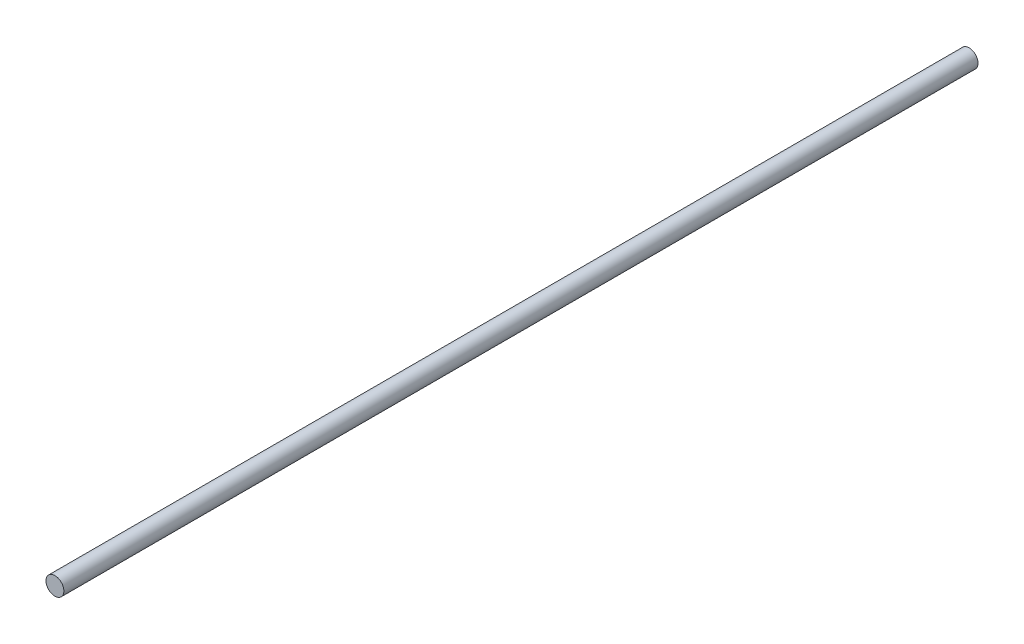
ISO-10303-21;
HEADER;
FILE_DESCRIPTION(('STEP AP214'),'2;1');
FILE_NAME('part.step','',(''),(''),'','','');
FILE_SCHEMA(('AUTOMOTIVE_DESIGN { 1 0 10303 214 1 1 1 1 }'));
ENDSEC;
DATA;
#1=APPLICATION_CONTEXT('core data for automotive mechanical design processes');
#2=APPLICATION_PROTOCOL_DEFINITION('international standard','automotive_design',2000,#1);
#3=PRODUCT_CONTEXT('',#1,'mechanical');
#4=PRODUCT('Part','Part','',(#3));
#5=PRODUCT_RELATED_PRODUCT_CATEGORY('part','',(#4));
#6=PRODUCT_DEFINITION_FORMATION('','',#4);
#7=PRODUCT_DEFINITION_CONTEXT('part definition',#1,'design');
#8=PRODUCT_DEFINITION('design','',#6,#7);
#9=PRODUCT_DEFINITION_SHAPE('','',#8);
#10=(LENGTH_UNIT() NAMED_UNIT(*) SI_UNIT(.MILLI.,.METRE.));
#11=(NAMED_UNIT(*) PLANE_ANGLE_UNIT() SI_UNIT($,.RADIAN.));
#12=(NAMED_UNIT(*) SI_UNIT($,.STERADIAN.) SOLID_ANGLE_UNIT());
#13=UNCERTAINTY_MEASURE_WITH_UNIT(LENGTH_MEASURE(1.E-05),#10,'distance_accuracy_value','');
#14=(GEOMETRIC_REPRESENTATION_CONTEXT(3) GLOBAL_UNCERTAINTY_ASSIGNED_CONTEXT((#13)) GLOBAL_UNIT_ASSIGNED_CONTEXT((#10,
#11,#12)) REPRESENTATION_CONTEXT('',''));
#15=CARTESIAN_POINT('',(0.,0.,0.));
#16=DIRECTION('',(0.,0.,1.));
#17=DIRECTION('',(1.,0.,0.));
#18=AXIS2_PLACEMENT_3D('',#15,#16,#17);
#19=CARTESIAN_POINT('',(0.,0.,307.));
#20=DIRECTION('',(0.,0.,-1.));
#21=DIRECTION('',(-1.,0.,0.));
#22=AXIS2_PLACEMENT_3D('',#19,#20,#21);
#23=CYLINDRICAL_SURFACE('',#22,3.);
#24=CARTESIAN_POINT('',(0.,0.,307.));
#25=DIRECTION('',(0.,0.,1.));
#26=DIRECTION('',(1.,0.,0.));
#27=AXIS2_PLACEMENT_3D('',#24,#25,#26);
#28=CIRCLE('',#27,3.);
#29=CARTESIAN_POINT('',(3.,0.,307.));
#30=VERTEX_POINT('',#29);
#31=EDGE_CURVE('E10',#30,#30,#28,.T.);
#32=ORIENTED_EDGE('',*,*,#31,.F.);
#33=EDGE_LOOP('',(#32));
#34=FACE_BOUND('',#33,.T.);
#35=CARTESIAN_POINT('',(0.,0.,0.));
#36=DIRECTION('',(0.,0.,1.));
#37=DIRECTION('',(1.,0.,0.));
#38=AXIS2_PLACEMENT_3D('',#35,#36,#37);
#39=CIRCLE('',#38,3.);
#40=CARTESIAN_POINT('',(3.,0.,0.));
#41=VERTEX_POINT('',#40);
#42=EDGE_CURVE('E42',#41,#41,#39,.T.);
#43=ORIENTED_EDGE('',*,*,#42,.T.);
#44=EDGE_LOOP('',(#43));
#45=FACE_BOUND('',#44,.T.);
#46=ADVANCED_FACE('F39',(#34,#45),#23,.T.);
#47=CARTESIAN_POINT('',(0.,0.,307.));
#48=DIRECTION('',(0.,0.,1.));
#49=DIRECTION('',(1.,0.,0.));
#50=AXIS2_PLACEMENT_3D('',#47,#48,#49);
#51=PLANE('',#50);
#52=ORIENTED_EDGE('',*,*,#31,.T.);
#53=EDGE_LOOP('',(#52));
#54=FACE_BOUND('',#53,.T.);
#55=ADVANCED_FACE('F56',(#54),#51,.T.);
#56=CARTESIAN_POINT('',(0.,0.,0.));
#57=DIRECTION('',(0.,0.,1.));
#58=DIRECTION('',(1.,0.,0.));
#59=AXIS2_PLACEMENT_3D('',#56,#57,#58);
#60=PLANE('',#59);
#61=ORIENTED_EDGE('',*,*,#42,.F.);
#62=EDGE_LOOP('',(#61));
#63=FACE_BOUND('',#62,.T.);
#64=ADVANCED_FACE('F54',(#63),#60,.F.);
#65=CLOSED_SHELL('',(#46,#55,#64));
#66=MANIFOLD_SOLID_BREP('B2',#65);
#67=ADVANCED_BREP_SHAPE_REPRESENTATION('',(#18,#66),#14);
#68=SHAPE_DEFINITION_REPRESENTATION(#9,#67);
ENDSEC;
END-ISO-10303-21;
